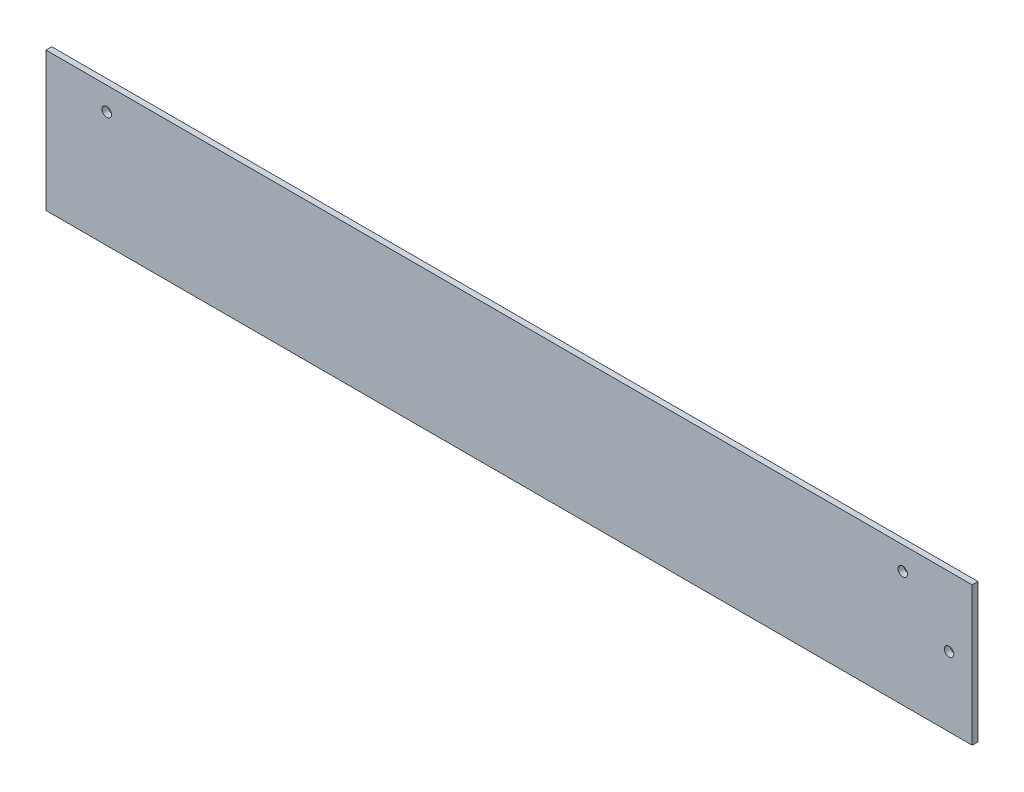
ISO-10303-21;
HEADER;
FILE_DESCRIPTION(('STEP AP214'),'2;1');
FILE_NAME('part.step','',(''),(''),'','','');
FILE_SCHEMA(('AUTOMOTIVE_DESIGN { 1 0 10303 214 1 1 1 1 }'));
ENDSEC;
DATA;
#1=APPLICATION_CONTEXT('core data for automotive mechanical design processes');
#2=APPLICATION_PROTOCOL_DEFINITION('international standard','automotive_design',2000,#1);
#3=PRODUCT_CONTEXT('',#1,'mechanical');
#4=PRODUCT('Part','Part','',(#3));
#5=PRODUCT_RELATED_PRODUCT_CATEGORY('part','',(#4));
#6=PRODUCT_DEFINITION_FORMATION('','',#4);
#7=PRODUCT_DEFINITION_CONTEXT('part definition',#1,'design');
#8=PRODUCT_DEFINITION('design','',#6,#7);
#9=PRODUCT_DEFINITION_SHAPE('','',#8);
#10=(LENGTH_UNIT() NAMED_UNIT(*) SI_UNIT(.MILLI.,.METRE.));
#11=(NAMED_UNIT(*) PLANE_ANGLE_UNIT() SI_UNIT($,.RADIAN.));
#12=(NAMED_UNIT(*) SI_UNIT($,.STERADIAN.) SOLID_ANGLE_UNIT());
#13=UNCERTAINTY_MEASURE_WITH_UNIT(LENGTH_MEASURE(1.E-05),#10,'distance_accuracy_value','');
#14=(GEOMETRIC_REPRESENTATION_CONTEXT(3) GLOBAL_UNCERTAINTY_ASSIGNED_CONTEXT((#13)) GLOBAL_UNIT_ASSIGNED_CONTEXT((#10,
#11,#12)) REPRESENTATION_CONTEXT('',''));
#15=CARTESIAN_POINT('',(0.,0.,0.));
#16=DIRECTION('',(0.,0.,1.));
#17=DIRECTION('',(1.,0.,0.));
#18=AXIS2_PLACEMENT_3D('',#15,#16,#17);
#19=CARTESIAN_POINT('',(508.,0.,3.175));
#20=DIRECTION('',(-1.,0.,0.));
#21=DIRECTION('',(0.,0.,1.));
#22=AXIS2_PLACEMENT_3D('',#19,#20,#21);
#23=PLANE('',#22);
#24=DIRECTION('',(0.,1.,0.));
#25=VECTOR('',#24,1.);
#26=CARTESIAN_POINT('',(508.,0.,3.175));
#27=LINE('',#26,#25);
#28=CARTESIAN_POINT('',(508.,431.8,3.175));
#29=VERTEX_POINT('',#28);
#30=CARTESIAN_POINT('',(508.,508.,3.175));
#31=VERTEX_POINT('',#30);
#32=EDGE_CURVE('E65',#29,#31,#27,.T.);
#33=ORIENTED_EDGE('',*,*,#32,.F.);
#34=DIRECTION('',(0.,0.,1.));
#35=VECTOR('',#34,1.);
#36=CARTESIAN_POINT('',(508.,431.8,0.));
#37=LINE('',#36,#35);
#38=CARTESIAN_POINT('',(508.,431.8,0.));
#39=VERTEX_POINT('',#38);
#40=EDGE_CURVE('E84',#39,#29,#37,.T.);
#41=ORIENTED_EDGE('',*,*,#40,.F.);
#42=DIRECTION('',(0.,1.,0.));
#43=VECTOR('',#42,1.);
#44=CARTESIAN_POINT('',(508.,0.,0.));
#45=LINE('',#44,#43);
#46=CARTESIAN_POINT('',(508.,508.,0.));
#47=VERTEX_POINT('',#46);
#48=EDGE_CURVE('E93',#39,#47,#45,.T.);
#49=ORIENTED_EDGE('',*,*,#48,.T.);
#50=DIRECTION('',(0.,0.,-1.));
#51=VECTOR('',#50,1.);
#52=CARTESIAN_POINT('',(508.,508.,3.175));
#53=LINE('',#52,#51);
#54=EDGE_CURVE('E11',#31,#47,#53,.T.);
#55=ORIENTED_EDGE('',*,*,#54,.F.);
#56=EDGE_LOOP('',(#33,#41,#49,#55));
#57=FACE_BOUND('',#56,.T.);
#58=ADVANCED_FACE('F42',(#57),#23,.F.);
#59=CARTESIAN_POINT('',(0.,508.,3.175));
#60=DIRECTION('',(0.,-1.,0.));
#61=DIRECTION('',(0.,0.,-1.));
#62=AXIS2_PLACEMENT_3D('',#59,#60,#61);
#63=PLANE('',#62);
#64=DIRECTION('',(-1.,0.,0.));
#65=VECTOR('',#64,1.);
#66=CARTESIAN_POINT('',(0.,508.,0.));
#67=LINE('',#66,#65);
#68=CARTESIAN_POINT('',(0.,508.,0.));
#69=VERTEX_POINT('',#68);
#70=EDGE_CURVE('E99',#47,#69,#67,.T.);
#71=ORIENTED_EDGE('',*,*,#70,.T.);
#72=DIRECTION('',(0.,0.,1.));
#73=VECTOR('',#72,1.);
#74=CARTESIAN_POINT('',(0.,508.,-121.314518073113));
#75=LINE('',#74,#73);
#76=CARTESIAN_POINT('',(0.,508.,3.175));
#77=VERTEX_POINT('',#76);
#78=EDGE_CURVE('E133',#69,#77,#75,.T.);
#79=ORIENTED_EDGE('',*,*,#78,.T.);
#80=DIRECTION('',(-1.,0.,0.));
#81=VECTOR('',#80,1.);
#82=CARTESIAN_POINT('',(0.,508.,3.175));
#83=LINE('',#82,#81);
#84=EDGE_CURVE('E50',#31,#77,#83,.T.);
#85=ORIENTED_EDGE('',*,*,#84,.F.);
#86=ORIENTED_EDGE('',*,*,#54,.T.);
#87=EDGE_LOOP('',(#71,#79,#85,#86));
#88=FACE_BOUND('',#87,.T.);
#89=ADVANCED_FACE('F153',(#88),#63,.F.);
#90=CARTESIAN_POINT('',(0.,0.,3.175));
#91=DIRECTION('',(0.,0.,-1.));
#92=DIRECTION('',(-1.,0.,0.));
#93=AXIS2_PLACEMENT_3D('',#90,#91,#92);
#94=PLANE('',#93);
#95=CARTESIAN_POINT('',(495.3,469.9,3.175));
#96=DIRECTION('',(0.,0.,1.));
#97=DIRECTION('',(1.,0.,0.));
#98=AXIS2_PLACEMENT_3D('',#95,#96,#97);
#99=CIRCLE('',#98,2.60000000000001);
#100=CARTESIAN_POINT('',(497.9,469.9,3.175));
#101=VERTEX_POINT('',#100);
#102=EDGE_CURVE('E101',#101,#101,#99,.T.);
#103=ORIENTED_EDGE('',*,*,#102,.F.);
#104=EDGE_LOOP('',(#103));
#105=FACE_BOUND('',#104,.T.);
#106=CARTESIAN_POINT('',(33.3374999999999,495.3,3.175));
#107=DIRECTION('',(0.,0.,1.));
#108=DIRECTION('',(1.,0.,0.));
#109=AXIS2_PLACEMENT_3D('',#106,#107,#108);
#110=CIRCLE('',#109,2.59999999999999);
#111=CARTESIAN_POINT('',(35.9374999999999,495.3,3.175));
#112=VERTEX_POINT('',#111);
#113=EDGE_CURVE('E115',#112,#112,#110,.T.);
#114=ORIENTED_EDGE('',*,*,#113,.F.);
#115=EDGE_LOOP('',(#114));
#116=FACE_BOUND('',#115,.T.);
#117=CARTESIAN_POINT('',(469.9,495.3,3.175));
#118=DIRECTION('',(0.,0.,1.));
#119=DIRECTION('',(1.,0.,0.));
#120=AXIS2_PLACEMENT_3D('',#117,#118,#119);
#121=CIRCLE('',#120,2.60000000000001);
#122=CARTESIAN_POINT('',(472.5,495.3,3.175));
#123=VERTEX_POINT('',#122);
#124=EDGE_CURVE('E121',#123,#123,#121,.T.);
#125=ORIENTED_EDGE('',*,*,#124,.F.);
#126=EDGE_LOOP('',(#125));
#127=FACE_BOUND('',#126,.T.);
#128=DIRECTION('',(0.,-1.,0.));
#129=VECTOR('',#128,1.);
#130=CARTESIAN_POINT('',(0.,388.453750000003,3.175));
#131=LINE('',#130,#129);
#132=CARTESIAN_POINT('',(0.,431.8,3.175));
#133=VERTEX_POINT('',#132);
#134=EDGE_CURVE('E137',#77,#133,#131,.T.);
#135=ORIENTED_EDGE('',*,*,#134,.T.);
#136=DIRECTION('',(-1.,0.,0.));
#137=VECTOR('',#136,1.);
#138=CARTESIAN_POINT('',(508.,431.8,3.175));
#139=LINE('',#138,#137);
#140=EDGE_CURVE('E57',#29,#133,#139,.T.);
#141=ORIENTED_EDGE('',*,*,#140,.F.);
#142=ORIENTED_EDGE('',*,*,#32,.T.);
#143=ORIENTED_EDGE('',*,*,#84,.T.);
#144=EDGE_LOOP('',(#135,#141,#142,#143));
#145=FACE_BOUND('',#144,.T.);
#146=ADVANCED_FACE('F150',(#105,#116,#127,#145),#94,.F.);
#147=CARTESIAN_POINT('',(0.,0.,0.));
#148=DIRECTION('',(0.,0.,-1.));
#149=DIRECTION('',(-1.,0.,0.));
#150=AXIS2_PLACEMENT_3D('',#147,#148,#149);
#151=PLANE('',#150);
#152=DIRECTION('',(-1.,0.,0.));
#153=VECTOR('',#152,1.);
#154=CARTESIAN_POINT('',(508.,431.8,0.));
#155=LINE('',#154,#153);
#156=CARTESIAN_POINT('',(0.,431.8,0.));
#157=VERTEX_POINT('',#156);
#158=EDGE_CURVE('E81',#39,#157,#155,.T.);
#159=ORIENTED_EDGE('',*,*,#158,.T.);
#160=DIRECTION('',(0.,-1.,0.));
#161=VECTOR('',#160,1.);
#162=CARTESIAN_POINT('',(0.,388.453750000003,0.));
#163=LINE('',#162,#161);
#164=EDGE_CURVE('E122',#69,#157,#163,.T.);
#165=ORIENTED_EDGE('',*,*,#164,.F.);
#166=ORIENTED_EDGE('',*,*,#70,.F.);
#167=ORIENTED_EDGE('',*,*,#48,.F.);
#168=EDGE_LOOP('',(#159,#165,#166,#167));
#169=FACE_BOUND('',#168,.T.);
#170=CARTESIAN_POINT('',(495.3,469.9,0.));
#171=DIRECTION('',(0.,0.,1.));
#172=DIRECTION('',(1.,0.,0.));
#173=AXIS2_PLACEMENT_3D('',#170,#171,#172);
#174=CIRCLE('',#173,2.60000000000001);
#175=CARTESIAN_POINT('',(497.9,469.9,0.));
#176=VERTEX_POINT('',#175);
#177=EDGE_CURVE('E106',#176,#176,#174,.T.);
#178=ORIENTED_EDGE('',*,*,#177,.T.);
#179=EDGE_LOOP('',(#178));
#180=FACE_BOUND('',#179,.T.);
#181=CARTESIAN_POINT('',(33.3374999999999,495.3,0.));
#182=DIRECTION('',(0.,0.,1.));
#183=DIRECTION('',(1.,0.,0.));
#184=AXIS2_PLACEMENT_3D('',#181,#182,#183);
#185=CIRCLE('',#184,2.59999999999999);
#186=CARTESIAN_POINT('',(35.9374999999999,495.3,0.));
#187=VERTEX_POINT('',#186);
#188=EDGE_CURVE('E126',#187,#187,#185,.T.);
#189=ORIENTED_EDGE('',*,*,#188,.T.);
#190=EDGE_LOOP('',(#189));
#191=FACE_BOUND('',#190,.T.);
#192=CARTESIAN_POINT('',(469.9,495.3,0.));
#193=DIRECTION('',(0.,0.,1.));
#194=DIRECTION('',(1.,0.,0.));
#195=AXIS2_PLACEMENT_3D('',#192,#193,#194);
#196=CIRCLE('',#195,2.60000000000001);
#197=CARTESIAN_POINT('',(472.5,495.3,0.));
#198=VERTEX_POINT('',#197);
#199=EDGE_CURVE('E117',#198,#198,#196,.T.);
#200=ORIENTED_EDGE('',*,*,#199,.T.);
#201=EDGE_LOOP('',(#200));
#202=FACE_BOUND('',#201,.T.);
#203=ADVANCED_FACE('F97',(#169,#180,#191,#202),#151,.T.);
#204=CARTESIAN_POINT('',(469.9,495.3,0.));
#205=DIRECTION('',(0.,0.,1.));
#206=DIRECTION('',(1.,0.,0.));
#207=AXIS2_PLACEMENT_3D('',#204,#205,#206);
#208=CYLINDRICAL_SURFACE('',#207,2.60000000000001);
#209=ORIENTED_EDGE('',*,*,#199,.F.);
#210=EDGE_LOOP('',(#209));
#211=FACE_BOUND('',#210,.T.);
#212=ORIENTED_EDGE('',*,*,#124,.T.);
#213=EDGE_LOOP('',(#212));
#214=FACE_BOUND('',#213,.T.);
#215=ADVANCED_FACE('F165',(#211,#214),#208,.F.);
#216=CARTESIAN_POINT('',(33.3374999999999,495.3,0.));
#217=DIRECTION('',(0.,0.,1.));
#218=DIRECTION('',(1.,0.,0.));
#219=AXIS2_PLACEMENT_3D('',#216,#217,#218);
#220=CYLINDRICAL_SURFACE('',#219,2.59999999999999);
#221=ORIENTED_EDGE('',*,*,#188,.F.);
#222=EDGE_LOOP('',(#221));
#223=FACE_BOUND('',#222,.T.);
#224=ORIENTED_EDGE('',*,*,#113,.T.);
#225=EDGE_LOOP('',(#224));
#226=FACE_BOUND('',#225,.T.);
#227=ADVANCED_FACE('F170',(#223,#226),#220,.F.);
#228=CARTESIAN_POINT('',(495.3,469.9,0.));
#229=DIRECTION('',(0.,0.,1.));
#230=DIRECTION('',(1.,0.,0.));
#231=AXIS2_PLACEMENT_3D('',#228,#229,#230);
#232=CYLINDRICAL_SURFACE('',#231,2.60000000000001);
#233=ORIENTED_EDGE('',*,*,#177,.F.);
#234=EDGE_LOOP('',(#233));
#235=FACE_BOUND('',#234,.T.);
#236=ORIENTED_EDGE('',*,*,#102,.T.);
#237=EDGE_LOOP('',(#236));
#238=FACE_BOUND('',#237,.T.);
#239=ADVANCED_FACE('F167',(#235,#238),#232,.F.);
#240=CARTESIAN_POINT('',(0.,388.453750000003,-121.314518073113));
#241=DIRECTION('',(-1.,0.,0.));
#242=DIRECTION('',(0.,0.,1.));
#243=AXIS2_PLACEMENT_3D('',#240,#241,#242);
#244=PLANE('',#243);
#245=DIRECTION('',(0.,0.,1.));
#246=VECTOR('',#245,1.);
#247=CARTESIAN_POINT('',(0.,431.8,0.));
#248=LINE('',#247,#246);
#249=EDGE_CURVE('E85',#157,#133,#248,.T.);
#250=ORIENTED_EDGE('',*,*,#249,.T.);
#251=ORIENTED_EDGE('',*,*,#134,.F.);
#252=ORIENTED_EDGE('',*,*,#78,.F.);
#253=ORIENTED_EDGE('',*,*,#164,.T.);
#254=EDGE_LOOP('',(#250,#251,#252,#253));
#255=FACE_BOUND('',#254,.T.);
#256=ADVANCED_FACE('F148',(#255),#244,.T.);
#257=CARTESIAN_POINT('',(508.,431.8,0.));
#258=DIRECTION('',(0.,1.,0.));
#259=DIRECTION('',(-1.,0.,0.));
#260=AXIS2_PLACEMENT_3D('',#257,#258,#259);
#261=PLANE('',#260);
#262=ORIENTED_EDGE('',*,*,#140,.T.);
#263=ORIENTED_EDGE('',*,*,#249,.F.);
#264=ORIENTED_EDGE('',*,*,#158,.F.);
#265=ORIENTED_EDGE('',*,*,#40,.T.);
#266=EDGE_LOOP('',(#262,#263,#264,#265));
#267=FACE_BOUND('',#266,.T.);
#268=ADVANCED_FACE('F83',(#267),#261,.F.);
#269=CLOSED_SHELL('',(#58,#89,#146,#203,#215,#227,#239,#256,#268));
#270=MANIFOLD_SOLID_BREP('B2',#269);
#271=ADVANCED_BREP_SHAPE_REPRESENTATION('',(#18,#270),#14);
#272=SHAPE_DEFINITION_REPRESENTATION(#9,#271);
ENDSEC;
END-ISO-10303-21;
